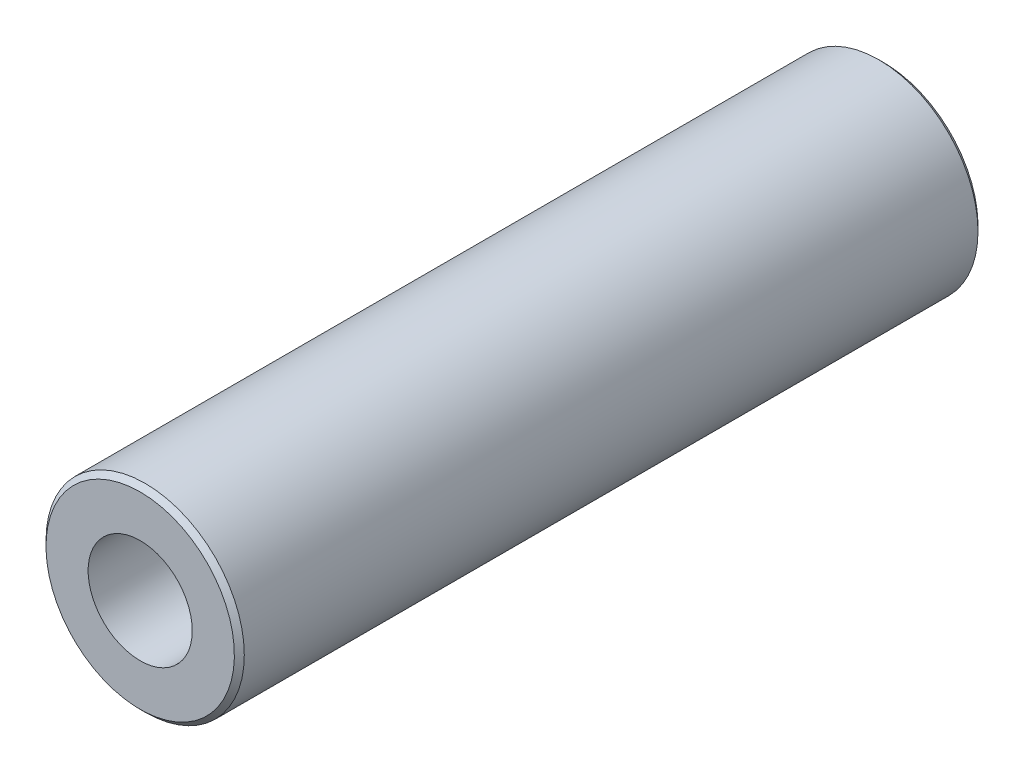
ISO-10303-21;
HEADER;
FILE_DESCRIPTION(('STEP AP214'),'2;1');
FILE_NAME('part.step','',(''),(''),'','','');
FILE_SCHEMA(('AUTOMOTIVE_DESIGN { 1 0 10303 214 1 1 1 1 }'));
ENDSEC;
DATA;
#1=APPLICATION_CONTEXT('core data for automotive mechanical design processes');
#2=APPLICATION_PROTOCOL_DEFINITION('international standard','automotive_design',2000,#1);
#3=PRODUCT_CONTEXT('',#1,'mechanical');
#4=PRODUCT('Part','Part','',(#3));
#5=PRODUCT_RELATED_PRODUCT_CATEGORY('part','',(#4));
#6=PRODUCT_DEFINITION_FORMATION('','',#4);
#7=PRODUCT_DEFINITION_CONTEXT('part definition',#1,'design');
#8=PRODUCT_DEFINITION('design','',#6,#7);
#9=PRODUCT_DEFINITION_SHAPE('','',#8);
#10=(LENGTH_UNIT() NAMED_UNIT(*) SI_UNIT(.MILLI.,.METRE.));
#11=(NAMED_UNIT(*) PLANE_ANGLE_UNIT() SI_UNIT($,.RADIAN.));
#12=(NAMED_UNIT(*) SI_UNIT($,.STERADIAN.) SOLID_ANGLE_UNIT());
#13=UNCERTAINTY_MEASURE_WITH_UNIT(LENGTH_MEASURE(1.E-05),#10,'distance_accuracy_value','');
#14=(GEOMETRIC_REPRESENTATION_CONTEXT(3) GLOBAL_UNCERTAINTY_ASSIGNED_CONTEXT((#13)) GLOBAL_UNIT_ASSIGNED_CONTEXT((#10,
#11,#12)) REPRESENTATION_CONTEXT('',''));
#15=CARTESIAN_POINT('',(0.,0.,0.));
#16=DIRECTION('',(0.,0.,1.));
#17=DIRECTION('',(1.,0.,0.));
#18=AXIS2_PLACEMENT_3D('',#15,#16,#17);
#19=CARTESIAN_POINT('',(0.,0.,15.));
#20=DIRECTION('',(0.,0.,1.));
#21=DIRECTION('',(0.,-1.,0.));
#22=AXIS2_PLACEMENT_3D('',#19,#20,#21);
#23=CYLINDRICAL_SURFACE('',#22,4.);
#24=CARTESIAN_POINT('',(0.,0.,-14.8));
#25=DIRECTION('',(0.,0.,1.));
#26=DIRECTION('',(0.,-1.,0.));
#27=AXIS2_PLACEMENT_3D('',#24,#25,#26);
#28=CIRCLE('',#27,4.);
#29=CARTESIAN_POINT('',(0.,-4.,-14.8));
#30=VERTEX_POINT('',#29);
#31=EDGE_CURVE('E82',#30,#30,#28,.T.);
#32=ORIENTED_EDGE('',*,*,#31,.T.);
#33=EDGE_LOOP('',(#32));
#34=FACE_BOUND('',#33,.T.);
#35=CARTESIAN_POINT('',(0.,0.,14.8));
#36=DIRECTION('',(0.,0.,-1.));
#37=DIRECTION('',(0.,1.,0.));
#38=AXIS2_PLACEMENT_3D('',#35,#36,#37);
#39=CIRCLE('',#38,4.);
#40=CARTESIAN_POINT('',(0.,4.,14.8));
#41=VERTEX_POINT('',#40);
#42=EDGE_CURVE('E79',#41,#41,#39,.T.);
#43=ORIENTED_EDGE('',*,*,#42,.T.);
#44=EDGE_LOOP('',(#43));
#45=FACE_BOUND('',#44,.T.);
#46=ADVANCED_FACE('F43',(#34,#45),#23,.T.);
#47=CARTESIAN_POINT('',(0.,4.,15.));
#48=DIRECTION('',(0.,0.,-1.));
#49=DIRECTION('',(0.,1.,0.));
#50=AXIS2_PLACEMENT_3D('',#47,#48,#49);
#51=PLANE('',#50);
#52=CARTESIAN_POINT('',(0.,0.,15.));
#53=DIRECTION('',(0.,0.,-1.));
#54=DIRECTION('',(0.,1.,0.));
#55=AXIS2_PLACEMENT_3D('',#52,#53,#54);
#56=CIRCLE('',#55,3.79999999999999);
#57=CARTESIAN_POINT('',(0.,3.79999999999999,15.));
#58=VERTEX_POINT('',#57);
#59=EDGE_CURVE('E11',#58,#58,#56,.F.);
#60=ORIENTED_EDGE('',*,*,#59,.T.);
#61=EDGE_LOOP('',(#60));
#62=FACE_BOUND('',#61,.T.);
#63=CARTESIAN_POINT('',(0.,0.,15.));
#64=DIRECTION('',(0.,0.,1.));
#65=DIRECTION('',(1.,0.,0.));
#66=AXIS2_PLACEMENT_3D('',#63,#64,#65);
#67=CIRCLE('',#66,2.1);
#68=CARTESIAN_POINT('',(2.1,0.,15.));
#69=VERTEX_POINT('',#68);
#70=EDGE_CURVE('E68',#69,#69,#67,.T.);
#71=ORIENTED_EDGE('',*,*,#70,.F.);
#72=EDGE_LOOP('',(#71));
#73=FACE_BOUND('',#72,.T.);
#74=ADVANCED_FACE('F97',(#62,#73),#51,.F.);
#75=CARTESIAN_POINT('',(0.,0.,-15.));
#76=DIRECTION('',(0.,0.,1.));
#77=DIRECTION('',(0.,-1.,0.));
#78=AXIS2_PLACEMENT_3D('',#75,#76,#77);
#79=PLANE('',#78);
#80=CARTESIAN_POINT('',(0.,0.,-15.));
#81=DIRECTION('',(0.,0.,1.));
#82=DIRECTION('',(0.,-1.,0.));
#83=AXIS2_PLACEMENT_3D('',#80,#81,#82);
#84=CIRCLE('',#83,3.8);
#85=CARTESIAN_POINT('',(0.,-3.8,-15.));
#86=VERTEX_POINT('',#85);
#87=EDGE_CURVE('E52',#86,#86,#84,.F.);
#88=ORIENTED_EDGE('',*,*,#87,.T.);
#89=EDGE_LOOP('',(#88));
#90=FACE_BOUND('',#89,.T.);
#91=CARTESIAN_POINT('',(0.,0.,-15.));
#92=DIRECTION('',(0.,0.,-1.));
#93=DIRECTION('',(-1.,0.,0.));
#94=AXIS2_PLACEMENT_3D('',#91,#92,#93);
#95=CIRCLE('',#94,2.1);
#96=CARTESIAN_POINT('',(-2.1,0.,-15.));
#97=VERTEX_POINT('',#96);
#98=EDGE_CURVE('E69',#97,#97,#95,.T.);
#99=ORIENTED_EDGE('',*,*,#98,.F.);
#100=EDGE_LOOP('',(#99));
#101=FACE_BOUND('',#100,.T.);
#102=ADVANCED_FACE('F87',(#90,#101),#79,.F.);
#103=CARTESIAN_POINT('',(0.,0.,1.5));
#104=DIRECTION('',(0.,0.,1.));
#105=DIRECTION('',(1.,0.,0.));
#106=AXIS2_PLACEMENT_3D('',#103,#104,#105);
#107=CONICAL_SURFACE('',#106,2.1,1.02974425867665);
#108=CARTESIAN_POINT('',(0.,0.,0.238192700042123));
#109=VERTEX_POINT('',#108);
#110=VERTEX_LOOP('',#109);
#111=FACE_BOUND('',#110,.T.);
#112=CARTESIAN_POINT('',(0.,0.,1.5));
#113=DIRECTION('',(0.,0.,1.));
#114=DIRECTION('',(1.,0.,0.));
#115=AXIS2_PLACEMENT_3D('',#112,#113,#114);
#116=CIRCLE('',#115,2.1);
#117=CARTESIAN_POINT('',(2.1,0.,1.5));
#118=VERTEX_POINT('',#117);
#119=EDGE_CURVE('E72',#118,#118,#116,.T.);
#120=ORIENTED_EDGE('',*,*,#119,.T.);
#121=EDGE_LOOP('',(#120));
#122=FACE_BOUND('',#121,.T.);
#123=ADVANCED_FACE('F111',(#111,#122),#107,.F.);
#124=CARTESIAN_POINT('',(0.,0.,15.));
#125=DIRECTION('',(0.,0.,1.));
#126=DIRECTION('',(1.,0.,0.));
#127=AXIS2_PLACEMENT_3D('',#124,#125,#126);
#128=CYLINDRICAL_SURFACE('',#127,2.1);
#129=ORIENTED_EDGE('',*,*,#119,.F.);
#130=EDGE_LOOP('',(#129));
#131=FACE_BOUND('',#130,.T.);
#132=ORIENTED_EDGE('',*,*,#70,.T.);
#133=EDGE_LOOP('',(#132));
#134=FACE_BOUND('',#133,.T.);
#135=ADVANCED_FACE('F62',(#131,#134),#128,.F.);
#136=CARTESIAN_POINT('',(0.,0.,-1.5));
#137=DIRECTION('',(0.,0.,-1.));
#138=DIRECTION('',(-1.,0.,0.));
#139=AXIS2_PLACEMENT_3D('',#136,#137,#138);
#140=CONICAL_SURFACE('',#139,2.1,1.02974425867665);
#141=CARTESIAN_POINT('',(0.,0.,-0.238192700042123));
#142=VERTEX_POINT('',#141);
#143=VERTEX_LOOP('',#142);
#144=FACE_BOUND('',#143,.T.);
#145=CARTESIAN_POINT('',(0.,0.,-1.5));
#146=DIRECTION('',(0.,0.,-1.));
#147=DIRECTION('',(-1.,0.,0.));
#148=AXIS2_PLACEMENT_3D('',#145,#146,#147);
#149=CIRCLE('',#148,2.1);
#150=CARTESIAN_POINT('',(-2.1,0.,-1.5));
#151=VERTEX_POINT('',#150);
#152=EDGE_CURVE('E66',#151,#151,#149,.T.);
#153=ORIENTED_EDGE('',*,*,#152,.T.);
#154=EDGE_LOOP('',(#153));
#155=FACE_BOUND('',#154,.T.);
#156=ADVANCED_FACE('F58',(#144,#155),#140,.F.);
#157=CARTESIAN_POINT('',(0.,0.,-15.));
#158=DIRECTION('',(0.,0.,-1.));
#159=DIRECTION('',(-1.,0.,0.));
#160=AXIS2_PLACEMENT_3D('',#157,#158,#159);
#161=CYLINDRICAL_SURFACE('',#160,2.1);
#162=ORIENTED_EDGE('',*,*,#152,.F.);
#163=EDGE_LOOP('',(#162));
#164=FACE_BOUND('',#163,.T.);
#165=ORIENTED_EDGE('',*,*,#98,.T.);
#166=EDGE_LOOP('',(#165));
#167=FACE_BOUND('',#166,.T.);
#168=ADVANCED_FACE('F61',(#164,#167),#161,.F.);
#169=CARTESIAN_POINT('',(0.,0.,-14.8));
#170=DIRECTION('',(0.,0.,1.));
#171=DIRECTION('',(0.,-1.,0.));
#172=AXIS2_PLACEMENT_3D('',#169,#170,#171);
#173=CONICAL_SURFACE('',#172,4.,0.785398163397459);
#174=ORIENTED_EDGE('',*,*,#87,.F.);
#175=EDGE_LOOP('',(#174));
#176=FACE_BOUND('',#175,.T.);
#177=ORIENTED_EDGE('',*,*,#31,.F.);
#178=EDGE_LOOP('',(#177));
#179=FACE_BOUND('',#178,.T.);
#180=ADVANCED_FACE('F90',(#176,#179),#173,.T.);
#181=CARTESIAN_POINT('',(0.,0.,15.));
#182=DIRECTION('',(0.,0.,-1.));
#183=DIRECTION('',(0.,1.,0.));
#184=AXIS2_PLACEMENT_3D('',#181,#182,#183);
#185=CONICAL_SURFACE('',#184,3.79999999999999,0.785398163397446);
#186=ORIENTED_EDGE('',*,*,#42,.F.);
#187=EDGE_LOOP('',(#186));
#188=FACE_BOUND('',#187,.T.);
#189=ORIENTED_EDGE('',*,*,#59,.F.);
#190=EDGE_LOOP('',(#189));
#191=FACE_BOUND('',#190,.T.);
#192=ADVANCED_FACE('F46',(#188,#191),#185,.T.);
#193=CLOSED_SHELL('',(#46,#74,#102,#123,#135,#156,#168,#180,#192));
#194=MANIFOLD_SOLID_BREP('B2',#193);
#195=ADVANCED_BREP_SHAPE_REPRESENTATION('',(#18,#194),#14);
#196=SHAPE_DEFINITION_REPRESENTATION(#9,#195);
ENDSEC;
END-ISO-10303-21;
